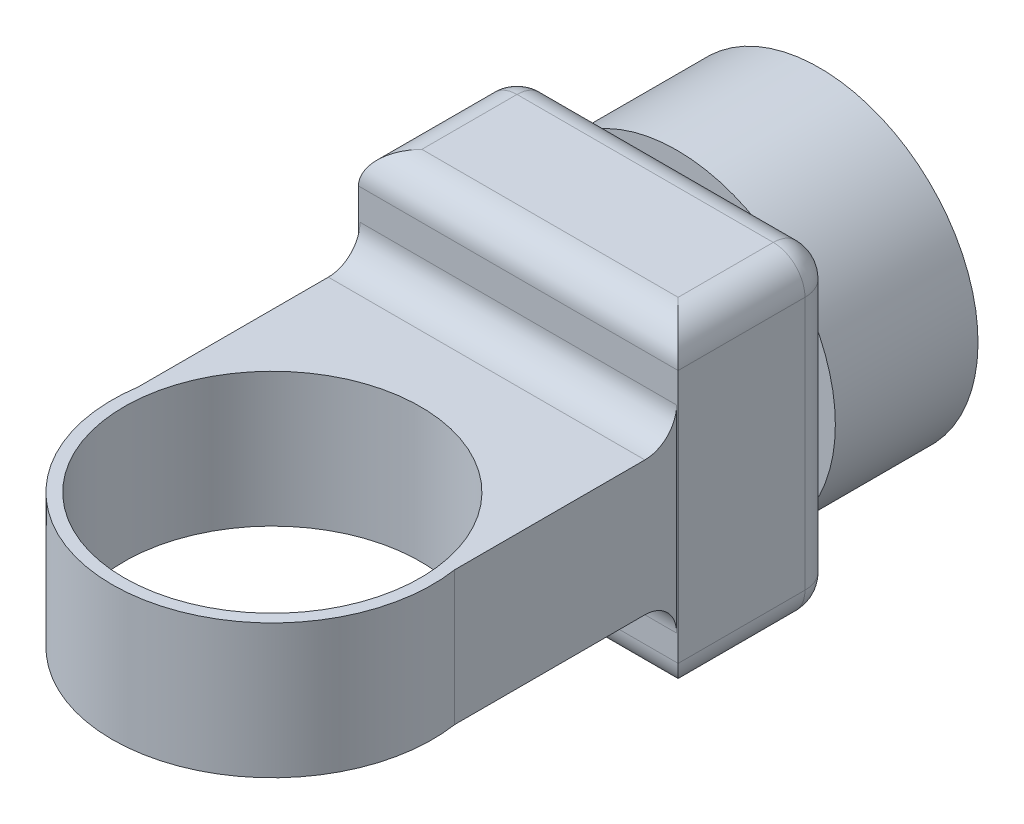
ISO-10303-21;
HEADER;
FILE_DESCRIPTION(('STEP AP214'),'2;1');
FILE_NAME('part.step','',(''),(''),'','','');
FILE_SCHEMA(('AUTOMOTIVE_DESIGN { 1 0 10303 214 1 1 1 1 }'));
ENDSEC;
DATA;
#1=APPLICATION_CONTEXT('core data for automotive mechanical design processes');
#2=APPLICATION_PROTOCOL_DEFINITION('international standard','automotive_design',2000,#1);
#3=PRODUCT_CONTEXT('',#1,'mechanical');
#4=PRODUCT('Part','Part','',(#3));
#5=PRODUCT_RELATED_PRODUCT_CATEGORY('part','',(#4));
#6=PRODUCT_DEFINITION_FORMATION('','',#4);
#7=PRODUCT_DEFINITION_CONTEXT('part definition',#1,'design');
#8=PRODUCT_DEFINITION('design','',#6,#7);
#9=PRODUCT_DEFINITION_SHAPE('','',#8);
#10=(LENGTH_UNIT() NAMED_UNIT(*) SI_UNIT(.MILLI.,.METRE.));
#11=(NAMED_UNIT(*) PLANE_ANGLE_UNIT() SI_UNIT($,.RADIAN.));
#12=(NAMED_UNIT(*) SI_UNIT($,.STERADIAN.) SOLID_ANGLE_UNIT());
#13=UNCERTAINTY_MEASURE_WITH_UNIT(LENGTH_MEASURE(1.E-05),#10,'distance_accuracy_value','');
#14=(GEOMETRIC_REPRESENTATION_CONTEXT(3) GLOBAL_UNCERTAINTY_ASSIGNED_CONTEXT((#13)) GLOBAL_UNIT_ASSIGNED_CONTEXT((#10,
#11,#12)) REPRESENTATION_CONTEXT('',''));
#15=CARTESIAN_POINT('',(0.,0.,0.));
#16=DIRECTION('',(0.,0.,1.));
#17=DIRECTION('',(1.,0.,0.));
#18=AXIS2_PLACEMENT_3D('',#15,#16,#17);
#19=CARTESIAN_POINT('',(0.,0.,-127.584165111629));
#20=DIRECTION('',(0.,0.,-1.));
#21=DIRECTION('',(-1.,0.,0.));
#22=AXIS2_PLACEMENT_3D('',#19,#20,#21);
#23=PLANE('',#22);
#24=DIRECTION('',(0.,1.,0.));
#25=VECTOR('',#24,1.);
#26=CARTESIAN_POINT('',(-40.4149864928319,71.964414077549,-127.584165111629));
#27=LINE('',#26,#25);
#28=CARTESIAN_POINT('',(-40.4149864928319,-18.035585922451,-127.584165111629));
#29=VERTEX_POINT('',#28);
#30=CARTESIAN_POINT('',(-40.4149864928319,-7.47414680412826,-127.584165111629));
#31=VERTEX_POINT('',#30);
#32=EDGE_CURVE('E200',#29,#31,#27,.T.);
#33=ORIENTED_EDGE('',*,*,#32,.T.);
#34=CARTESIAN_POINT('',(0.,21.964414077549,-127.584165111629));
#35=DIRECTION('',(0.,0.,-1.));
#36=DIRECTION('',(-1.,0.,0.));
#37=AXIS2_PLACEMENT_3D('',#34,#35,#36);
#38=CIRCLE('',#37,50.);
#39=CARTESIAN_POINT('',(-30.,-18.035585922451,-127.584165111629));
#40=VERTEX_POINT('',#39);
#41=EDGE_CURVE('E198',#40,#31,#38,.T.);
#42=ORIENTED_EDGE('',*,*,#41,.F.);
#43=DIRECTION('',(-1.,0.,0.));
#44=VECTOR('',#43,1.);
#45=CARTESIAN_POINT('',(-50.4149864928319,-18.035585922451,-127.584165111629));
#46=LINE('',#45,#44);
#47=EDGE_CURVE('E181',#40,#29,#46,.T.);
#48=ORIENTED_EDGE('',*,*,#47,.T.);
#49=EDGE_LOOP('',(#33,#42,#48));
#50=FACE_BOUND('',#49,.T.);
#51=ADVANCED_FACE('F41',(#50),#23,.T.);
#52=CARTESIAN_POINT('',(40.4149864928319,-18.035585922451,-127.584165111629));
#53=VERTEX_POINT('',#52);
#54=CARTESIAN_POINT('',(30.,-18.035585922451,-127.584165111629));
#55=VERTEX_POINT('',#54);
#56=EDGE_CURVE('E196',#53,#55,#46,.T.);
#57=ORIENTED_EDGE('',*,*,#56,.T.);
#58=CARTESIAN_POINT('',(40.4149864928319,-7.47414680412831,-127.584165111629));
#59=VERTEX_POINT('',#58);
#60=EDGE_CURVE('E215',#59,#55,#38,.T.);
#61=ORIENTED_EDGE('',*,*,#60,.F.);
#62=DIRECTION('',(0.,-1.,0.));
#63=VECTOR('',#62,1.);
#64=CARTESIAN_POINT('',(40.4149864928319,-28.035585922451,-127.584165111629));
#65=LINE('',#64,#63);
#66=EDGE_CURVE('E310',#59,#53,#65,.T.);
#67=ORIENTED_EDGE('',*,*,#66,.T.);
#68=EDGE_LOOP('',(#57,#61,#67));
#69=FACE_BOUND('',#68,.T.);
#70=ADVANCED_FACE('F439',(#69),#23,.T.);
#71=CARTESIAN_POINT('',(40.4149864928319,61.964414077549,-127.584165111629));
#72=VERTEX_POINT('',#71);
#73=CARTESIAN_POINT('',(40.4149864928319,51.4029749592263,-127.584165111629));
#74=VERTEX_POINT('',#73);
#75=EDGE_CURVE('E311',#72,#74,#65,.T.);
#76=ORIENTED_EDGE('',*,*,#75,.T.);
#77=CARTESIAN_POINT('',(30.,61.964414077549,-127.584165111629));
#78=VERTEX_POINT('',#77);
#79=EDGE_CURVE('E58',#78,#74,#38,.T.);
#80=ORIENTED_EDGE('',*,*,#79,.F.);
#81=DIRECTION('',(1.,0.,0.));
#82=VECTOR('',#81,1.);
#83=CARTESIAN_POINT('',(50.4149864928319,61.964414077549,-127.584165111629));
#84=LINE('',#83,#82);
#85=EDGE_CURVE('E308',#78,#72,#84,.T.);
#86=ORIENTED_EDGE('',*,*,#85,.T.);
#87=EDGE_LOOP('',(#76,#80,#86));
#88=FACE_BOUND('',#87,.T.);
#89=ADVANCED_FACE('F419',(#88),#23,.T.);
#90=CARTESIAN_POINT('',(0.,42.3,0.));
#91=DIRECTION('',(0.,1.,0.));
#92=DIRECTION('',(0.,0.,1.));
#93=AXIS2_PLACEMENT_3D('',#90,#91,#92);
#94=PLANE('',#93);
#95=DIRECTION('',(0.,0.,-1.));
#96=VECTOR('',#95,1.);
#97=CARTESIAN_POINT('',(49.9272514721125,42.3,-77.5841651116285));
#98=LINE('',#97,#96);
#99=CARTESIAN_POINT('',(49.9272514721125,42.3,-7.58416511162852));
#100=VERTEX_POINT('',#99);
#101=CARTESIAN_POINT('',(49.9272514721125,42.3,-67.5841651116285));
#102=VERTEX_POINT('',#101);
#103=EDGE_CURVE('E237',#100,#102,#98,.T.);
#104=ORIENTED_EDGE('',*,*,#103,.T.);
#105=DIRECTION('',(-1.,0.,0.));
#106=VECTOR('',#105,1.);
#107=CARTESIAN_POINT('',(0.,42.3,-67.5841651116285));
#108=LINE('',#107,#106);
#109=CARTESIAN_POINT('',(-49.9227485278875,42.3,-67.5841651116285));
#110=VERTEX_POINT('',#109);
#111=EDGE_CURVE('E277',#102,#110,#108,.T.);
#112=ORIENTED_EDGE('',*,*,#111,.T.);
#113=DIRECTION('',(0.,0.,1.));
#114=VECTOR('',#113,1.);
#115=CARTESIAN_POINT('',(-49.9227485278875,42.3,-77.5841651116285));
#116=LINE('',#115,#114);
#117=CARTESIAN_POINT('',(-49.9227485278875,42.3,-7.61374936685624));
#118=VERTEX_POINT('',#117);
#119=EDGE_CURVE('E242',#110,#118,#116,.T.);
#120=ORIENTED_EDGE('',*,*,#119,.T.);
#121=CARTESIAN_POINT('',(0.,42.3,0.));
#122=DIRECTION('',(0.,1.,0.));
#123=DIRECTION('',(0.,0.,1.));
#124=AXIS2_PLACEMENT_3D('',#121,#122,#123);
#125=CIRCLE('',#124,50.5);
#126=EDGE_CURVE('E261',#118,#100,#125,.T.);
#127=ORIENTED_EDGE('',*,*,#126,.T.);
#128=EDGE_LOOP('',(#104,#112,#120,#127));
#129=FACE_BOUND('',#128,.T.);
#130=CARTESIAN_POINT('',(0.,42.3,0.));
#131=DIRECTION('',(0.,1.,0.));
#132=DIRECTION('',(0.,0.,1.));
#133=AXIS2_PLACEMENT_3D('',#130,#131,#132);
#134=CIRCLE('',#133,46.75);
#135=CARTESIAN_POINT('',(0.,42.3,46.75));
#136=VERTEX_POINT('',#135);
#137=EDGE_CURVE('E255',#136,#136,#134,.T.);
#138=ORIENTED_EDGE('',*,*,#137,.F.);
#139=EDGE_LOOP('',(#138));
#140=FACE_BOUND('',#139,.T.);
#141=ADVANCED_FACE('F459',(#129,#140),#94,.T.);
#142=CARTESIAN_POINT('',(0.,0.,0.));
#143=DIRECTION('',(0.,1.,0.));
#144=DIRECTION('',(0.,0.,1.));
#145=AXIS2_PLACEMENT_3D('',#142,#143,#144);
#146=PLANE('',#145);
#147=DIRECTION('',(0.,0.,1.));
#148=VECTOR('',#147,1.);
#149=CARTESIAN_POINT('',(-49.9227485278875,0.,-77.5841651116285));
#150=LINE('',#149,#148);
#151=CARTESIAN_POINT('',(-49.9227485278875,0.,-67.5841651116285));
#152=VERTEX_POINT('',#151);
#153=CARTESIAN_POINT('',(-49.9227485278875,0.,-7.61374936685624));
#154=VERTEX_POINT('',#153);
#155=EDGE_CURVE('E241',#152,#154,#150,.T.);
#156=ORIENTED_EDGE('',*,*,#155,.F.);
#157=DIRECTION('',(-1.,0.,0.));
#158=VECTOR('',#157,1.);
#159=CARTESIAN_POINT('',(49.9272514721125,0.,-67.5841651116285));
#160=LINE('',#159,#158);
#161=CARTESIAN_POINT('',(49.9272514721125,0.,-67.5841651116285));
#162=VERTEX_POINT('',#161);
#163=EDGE_CURVE('E275',#152,#162,#160,.F.);
#164=ORIENTED_EDGE('',*,*,#163,.T.);
#165=DIRECTION('',(0.,0.,-1.));
#166=VECTOR('',#165,1.);
#167=CARTESIAN_POINT('',(49.9272514721125,0.,-77.5841651116285));
#168=LINE('',#167,#166);
#169=CARTESIAN_POINT('',(49.9272514721125,0.,-7.58416511162852));
#170=VERTEX_POINT('',#169);
#171=EDGE_CURVE('E238',#170,#162,#168,.T.);
#172=ORIENTED_EDGE('',*,*,#171,.F.);
#173=CARTESIAN_POINT('',(0.,0.,0.));
#174=DIRECTION('',(0.,1.,0.));
#175=DIRECTION('',(0.,0.,1.));
#176=AXIS2_PLACEMENT_3D('',#173,#174,#175);
#177=CIRCLE('',#176,50.5);
#178=EDGE_CURVE('E258',#154,#170,#177,.T.);
#179=ORIENTED_EDGE('',*,*,#178,.F.);
#180=EDGE_LOOP('',(#156,#164,#172,#179));
#181=FACE_BOUND('',#180,.T.);
#182=CARTESIAN_POINT('',(0.,0.,0.));
#183=DIRECTION('',(0.,1.,0.));
#184=DIRECTION('',(0.,0.,1.));
#185=AXIS2_PLACEMENT_3D('',#182,#183,#184);
#186=CIRCLE('',#185,46.75);
#187=CARTESIAN_POINT('',(0.,0.,46.75));
#188=VERTEX_POINT('',#187);
#189=EDGE_CURVE('E250',#188,#188,#186,.T.);
#190=ORIENTED_EDGE('',*,*,#189,.T.);
#191=EDGE_LOOP('',(#190));
#192=FACE_BOUND('',#191,.T.);
#193=ADVANCED_FACE('F463',(#181,#192),#146,.F.);
#194=CARTESIAN_POINT('',(0.,42.3,0.));
#195=DIRECTION('',(0.,-1.,0.));
#196=DIRECTION('',(0.,0.,-1.));
#197=AXIS2_PLACEMENT_3D('',#194,#195,#196);
#198=CYLINDRICAL_SURFACE('',#197,50.5);
#199=ORIENTED_EDGE('',*,*,#126,.F.);
#200=DIRECTION('',(0.,-1.,0.));
#201=VECTOR('',#200,1.);
#202=CARTESIAN_POINT('',(-49.9227485278875,42.3,-7.61374936685624));
#203=LINE('',#202,#201);
#204=EDGE_CURVE('E264',#118,#154,#203,.T.);
#205=ORIENTED_EDGE('',*,*,#204,.T.);
#206=ORIENTED_EDGE('',*,*,#178,.T.);
#207=DIRECTION('',(0.,1.,0.));
#208=VECTOR('',#207,1.);
#209=CARTESIAN_POINT('',(49.9272514721125,0.,-7.58416511162852));
#210=LINE('',#209,#208);
#211=EDGE_CURVE('E244',#170,#100,#210,.T.);
#212=ORIENTED_EDGE('',*,*,#211,.T.);
#213=EDGE_LOOP('',(#199,#205,#206,#212));
#214=FACE_BOUND('',#213,.T.);
#215=ADVANCED_FACE('F469',(#214),#198,.T.);
#216=CARTESIAN_POINT('',(0.,42.3,0.));
#217=DIRECTION('',(0.,-1.,0.));
#218=DIRECTION('',(0.,0.,-1.));
#219=AXIS2_PLACEMENT_3D('',#216,#217,#218);
#220=CYLINDRICAL_SURFACE('',#219,46.75);
#221=ORIENTED_EDGE('',*,*,#137,.T.);
#222=EDGE_LOOP('',(#221));
#223=FACE_BOUND('',#222,.T.);
#224=ORIENTED_EDGE('',*,*,#189,.F.);
#225=EDGE_LOOP('',(#224));
#226=FACE_BOUND('',#225,.T.);
#227=ADVANCED_FACE('F474',(#223,#226),#220,.F.);
#228=CARTESIAN_POINT('',(-49.9227485278875,0.,-77.5841651116285));
#229=DIRECTION('',(-1.,0.,0.));
#230=DIRECTION('',(0.,0.,1.));
#231=AXIS2_PLACEMENT_3D('',#228,#229,#230);
#232=PLANE('',#231);
#233=ORIENTED_EDGE('',*,*,#204,.F.);
#234=ORIENTED_EDGE('',*,*,#119,.F.);
#235=CARTESIAN_POINT('',(-49.9227485278875,52.3,-67.5841651116285));
#236=DIRECTION('',(-1.,0.,0.));
#237=DIRECTION('',(0.,0.,1.));
#238=AXIS2_PLACEMENT_3D('',#235,#236,#237);
#239=CIRCLE('',#238,10.);
#240=CARTESIAN_POINT('',(-49.9227485278875,52.3,-77.5841651116285));
#241=VERTEX_POINT('',#240);
#242=EDGE_CURVE('E285',#110,#241,#239,.F.);
#243=ORIENTED_EDGE('',*,*,#242,.T.);
#244=DIRECTION('',(0.,1.,0.));
#245=VECTOR('',#244,1.);
#246=CARTESIAN_POINT('',(-49.9227485278875,0.,-77.5841651116285));
#247=LINE('',#246,#245);
#248=CARTESIAN_POINT('',(-49.9227485278875,-10.,-77.5841651116285));
#249=VERTEX_POINT('',#248);
#250=EDGE_CURVE('E248',#249,#241,#247,.T.);
#251=ORIENTED_EDGE('',*,*,#250,.F.);
#252=CARTESIAN_POINT('',(-49.9227485278875,-10.,-67.5841651116285));
#253=DIRECTION('',(-1.,0.,0.));
#254=DIRECTION('',(0.,0.,1.));
#255=AXIS2_PLACEMENT_3D('',#252,#253,#254);
#256=CIRCLE('',#255,10.);
#257=EDGE_CURVE('E280',#249,#152,#256,.F.);
#258=ORIENTED_EDGE('',*,*,#257,.T.);
#259=ORIENTED_EDGE('',*,*,#155,.T.);
#260=EDGE_LOOP('',(#233,#234,#243,#251,#258,#259));
#261=FACE_BOUND('',#260,.T.);
#262=ADVANCED_FACE('F582',(#261),#232,.T.);
#263=CARTESIAN_POINT('',(49.9272514721125,0.,-77.5841651116285));
#264=DIRECTION('',(1.,0.,0.));
#265=DIRECTION('',(0.,0.,-1.));
#266=AXIS2_PLACEMENT_3D('',#263,#264,#265);
#267=PLANE('',#266);
#268=ORIENTED_EDGE('',*,*,#103,.F.);
#269=ORIENTED_EDGE('',*,*,#211,.F.);
#270=ORIENTED_EDGE('',*,*,#171,.T.);
#271=CARTESIAN_POINT('',(49.9272514721125,-10.,-67.5841651116285));
#272=DIRECTION('',(1.,0.,0.));
#273=DIRECTION('',(0.,0.,-1.));
#274=AXIS2_PLACEMENT_3D('',#271,#272,#273);
#275=CIRCLE('',#274,10.);
#276=CARTESIAN_POINT('',(49.9272514721125,-10.,-77.5841651116285));
#277=VERTEX_POINT('',#276);
#278=EDGE_CURVE('E282',#162,#277,#275,.F.);
#279=ORIENTED_EDGE('',*,*,#278,.T.);
#280=DIRECTION('',(0.,1.,0.));
#281=VECTOR('',#280,1.);
#282=CARTESIAN_POINT('',(49.9272514721125,0.,-77.5841651116285));
#283=LINE('',#282,#281);
#284=CARTESIAN_POINT('',(49.9272514721125,52.3,-77.5841651116285));
#285=VERTEX_POINT('',#284);
#286=EDGE_CURVE('E251',#277,#285,#283,.T.);
#287=ORIENTED_EDGE('',*,*,#286,.T.);
#288=CARTESIAN_POINT('',(49.9272514721125,52.3,-67.5841651116285));
#289=DIRECTION('',(1.,0.,0.));
#290=DIRECTION('',(0.,0.,-1.));
#291=AXIS2_PLACEMENT_3D('',#288,#289,#290);
#292=CIRCLE('',#291,10.);
#293=EDGE_CURVE('E288',#285,#102,#292,.F.);
#294=ORIENTED_EDGE('',*,*,#293,.T.);
#295=EDGE_LOOP('',(#268,#269,#270,#279,#287,#294));
#296=FACE_BOUND('',#295,.T.);
#297=ADVANCED_FACE('F572',(#296),#267,.T.);
#298=CARTESIAN_POINT('',(-50.4149864928319,71.964414077549,-127.584165111629));
#299=DIRECTION('',(1.,0.,0.));
#300=DIRECTION('',(0.,0.,-1.));
#301=AXIS2_PLACEMENT_3D('',#298,#299,#300);
#302=PLANE('',#301);
#303=DIRECTION('',(0.,1.,0.));
#304=VECTOR('',#303,1.);
#305=CARTESIAN_POINT('',(-50.4149864928319,-28.035585922451,-117.584165111629));
#306=LINE('',#305,#304);
#307=CARTESIAN_POINT('',(-50.4149864928319,61.964414077549,-117.584165111629));
#308=VERTEX_POINT('',#307);
#309=CARTESIAN_POINT('',(-50.4149864928319,-18.035585922451,-117.584165111629));
#310=VERTEX_POINT('',#309);
#311=EDGE_CURVE('E313',#308,#310,#306,.F.);
#312=ORIENTED_EDGE('',*,*,#311,.T.);
#313=DIRECTION('',(0.,0.,1.));
#314=VECTOR('',#313,1.);
#315=CARTESIAN_POINT('',(-50.4149864928319,-18.035585922451,-127.584165111629));
#316=LINE('',#315,#314);
#317=CARTESIAN_POINT('',(-50.4149864928319,-18.035585922451,-77.5841651116285));
#318=VERTEX_POINT('',#317);
#319=EDGE_CURVE('E317',#310,#318,#316,.T.);
#320=ORIENTED_EDGE('',*,*,#319,.T.);
#321=DIRECTION('',(0.,1.,0.));
#322=VECTOR('',#321,1.);
#323=CARTESIAN_POINT('',(-50.4149864928319,71.964414077549,-77.5841651116285));
#324=LINE('',#323,#322);
#325=CARTESIAN_POINT('',(-50.4149864928319,61.964414077549,-77.5841651116285));
#326=VERTEX_POINT('',#325);
#327=EDGE_CURVE('E231',#318,#326,#324,.T.);
#328=ORIENTED_EDGE('',*,*,#327,.T.);
#329=DIRECTION('',(0.,0.,1.));
#330=VECTOR('',#329,1.);
#331=CARTESIAN_POINT('',(-50.4149864928319,61.964414077549,-127.584165111629));
#332=LINE('',#331,#330);
#333=EDGE_CURVE('E315',#326,#308,#332,.F.);
#334=ORIENTED_EDGE('',*,*,#333,.T.);
#335=EDGE_LOOP('',(#312,#320,#328,#334));
#336=FACE_BOUND('',#335,.T.);
#337=ADVANCED_FACE('F380',(#336),#302,.F.);
#338=CARTESIAN_POINT('',(50.4149864928319,71.964414077549,-127.584165111629));
#339=DIRECTION('',(0.,-1.,0.));
#340=DIRECTION('',(0.,0.,-1.));
#341=AXIS2_PLACEMENT_3D('',#338,#339,#340);
#342=PLANE('',#341);
#343=DIRECTION('',(0.,0.,1.));
#344=VECTOR('',#343,1.);
#345=CARTESIAN_POINT('',(-40.4149864928319,71.964414077549,-127.584165111629));
#346=LINE('',#345,#344);
#347=CARTESIAN_POINT('',(-40.4149864928319,71.964414077549,-117.584165111629));
#348=VERTEX_POINT('',#347);
#349=CARTESIAN_POINT('',(-40.4149864928319,71.964414077549,-87.5841651116285));
#350=VERTEX_POINT('',#349);
#351=EDGE_CURVE('E323',#348,#350,#346,.T.);
#352=ORIENTED_EDGE('',*,*,#351,.T.);
#353=DIRECTION('',(1.,0.,0.));
#354=VECTOR('',#353,1.);
#355=CARTESIAN_POINT('',(50.4149864928319,71.964414077549,-87.5841651116285));
#356=LINE('',#355,#354);
#357=CARTESIAN_POINT('',(40.4149864928319,71.964414077549,-87.5841651116285));
#358=VERTEX_POINT('',#357);
#359=EDGE_CURVE('E11',#350,#358,#356,.T.);
#360=ORIENTED_EDGE('',*,*,#359,.T.);
#361=DIRECTION('',(0.,0.,1.));
#362=VECTOR('',#361,1.);
#363=CARTESIAN_POINT('',(40.4149864928319,71.964414077549,-127.584165111629));
#364=LINE('',#363,#362);
#365=CARTESIAN_POINT('',(40.4149864928319,71.964414077549,-117.584165111629));
#366=VERTEX_POINT('',#365);
#367=EDGE_CURVE('E50',#358,#366,#364,.F.);
#368=ORIENTED_EDGE('',*,*,#367,.T.);
#369=DIRECTION('',(1.,0.,0.));
#370=VECTOR('',#369,1.);
#371=CARTESIAN_POINT('',(-50.4149864928319,71.964414077549,-117.584165111629));
#372=LINE('',#371,#370);
#373=EDGE_CURVE('E325',#366,#348,#372,.F.);
#374=ORIENTED_EDGE('',*,*,#373,.T.);
#375=EDGE_LOOP('',(#352,#360,#368,#374));
#376=FACE_BOUND('',#375,.T.);
#377=ADVANCED_FACE('F554',(#376),#342,.F.);
#378=CARTESIAN_POINT('',(50.4149864928319,71.964414077549,-127.584165111629));
#379=DIRECTION('',(-1.,0.,0.));
#380=DIRECTION('',(0.,-1.,0.));
#381=AXIS2_PLACEMENT_3D('',#378,#379,#380);
#382=PLANE('',#381);
#383=DIRECTION('',(0.,-1.,0.));
#384=VECTOR('',#383,1.);
#385=CARTESIAN_POINT('',(50.4149864928319,71.964414077549,-77.5841651116285));
#386=LINE('',#385,#384);
#387=CARTESIAN_POINT('',(50.4149864928319,61.964414077549,-77.5841651116285));
#388=VERTEX_POINT('',#387);
#389=CARTESIAN_POINT('',(50.4149864928319,-18.035585922451,-77.5841651116285));
#390=VERTEX_POINT('',#389);
#391=EDGE_CURVE('E234',#388,#390,#386,.T.);
#392=ORIENTED_EDGE('',*,*,#391,.T.);
#393=DIRECTION('',(0.,0.,1.));
#394=VECTOR('',#393,1.);
#395=CARTESIAN_POINT('',(50.4149864928319,-18.035585922451,-127.584165111629));
#396=LINE('',#395,#394);
#397=CARTESIAN_POINT('',(50.4149864928319,-18.035585922451,-117.584165111629));
#398=VERTEX_POINT('',#397);
#399=EDGE_CURVE('E303',#390,#398,#396,.F.);
#400=ORIENTED_EDGE('',*,*,#399,.T.);
#401=DIRECTION('',(0.,-1.,0.));
#402=VECTOR('',#401,1.);
#403=CARTESIAN_POINT('',(50.4149864928319,71.964414077549,-117.584165111629));
#404=LINE('',#403,#402);
#405=CARTESIAN_POINT('',(50.4149864928319,61.964414077549,-117.584165111629));
#406=VERTEX_POINT('',#405);
#407=EDGE_CURVE('E299',#398,#406,#404,.F.);
#408=ORIENTED_EDGE('',*,*,#407,.T.);
#409=DIRECTION('',(0.,0.,1.));
#410=VECTOR('',#409,1.);
#411=CARTESIAN_POINT('',(50.4149864928319,61.964414077549,-127.584165111629));
#412=LINE('',#411,#410);
#413=EDGE_CURVE('E301',#406,#388,#412,.T.);
#414=ORIENTED_EDGE('',*,*,#413,.T.);
#415=EDGE_LOOP('',(#392,#400,#408,#414));
#416=FACE_BOUND('',#415,.T.);
#417=ADVANCED_FACE('F403',(#416),#382,.F.);
#418=CARTESIAN_POINT('',(50.4149864928319,-28.035585922451,-127.584165111629));
#419=DIRECTION('',(0.,1.,0.));
#420=DIRECTION('',(0.,0.,1.));
#421=AXIS2_PLACEMENT_3D('',#418,#419,#420);
#422=PLANE('',#421);
#423=DIRECTION('',(-1.,0.,0.));
#424=VECTOR('',#423,1.);
#425=CARTESIAN_POINT('',(50.4149864928319,-28.035585922451,-117.584165111629));
#426=LINE('',#425,#424);
#427=CARTESIAN_POINT('',(-40.4149864928319,-28.035585922451,-117.584165111629));
#428=VERTEX_POINT('',#427);
#429=CARTESIAN_POINT('',(40.4149864928319,-28.035585922451,-117.584165111629));
#430=VERTEX_POINT('',#429);
#431=EDGE_CURVE('E294',#428,#430,#426,.F.);
#432=ORIENTED_EDGE('',*,*,#431,.T.);
#433=DIRECTION('',(0.,0.,1.));
#434=VECTOR('',#433,1.);
#435=CARTESIAN_POINT('',(40.4149864928319,-28.035585922451,-127.584165111629));
#436=LINE('',#435,#434);
#437=CARTESIAN_POINT('',(40.4149864928319,-28.035585922451,-87.5841651116285));
#438=VERTEX_POINT('',#437);
#439=EDGE_CURVE('E296',#430,#438,#436,.T.);
#440=ORIENTED_EDGE('',*,*,#439,.T.);
#441=DIRECTION('',(-1.,0.,0.));
#442=VECTOR('',#441,1.);
#443=CARTESIAN_POINT('',(50.4149864928319,-28.035585922451,-87.5841651116285));
#444=LINE('',#443,#442);
#445=CARTESIAN_POINT('',(-40.4149864928319,-28.035585922451,-87.5841651116285));
#446=VERTEX_POINT('',#445);
#447=EDGE_CURVE('E290',#438,#446,#444,.T.);
#448=ORIENTED_EDGE('',*,*,#447,.T.);
#449=DIRECTION('',(0.,0.,1.));
#450=VECTOR('',#449,1.);
#451=CARTESIAN_POINT('',(-40.4149864928318,-28.035585922451,-127.584165111629));
#452=LINE('',#451,#450);
#453=EDGE_CURVE('E292',#446,#428,#452,.F.);
#454=ORIENTED_EDGE('',*,*,#453,.T.);
#455=EDGE_LOOP('',(#432,#440,#448,#454));
#456=FACE_BOUND('',#455,.T.);
#457=ADVANCED_FACE('F448',(#456),#422,.F.);
#458=CARTESIAN_POINT('',(-40.4149864928319,61.964414077549,-127.584165111629));
#459=VERTEX_POINT('',#458);
#460=CARTESIAN_POINT('',(-30.,61.964414077549,-127.584165111629));
#461=VERTEX_POINT('',#460);
#462=EDGE_CURVE('E194',#459,#461,#84,.T.);
#463=ORIENTED_EDGE('',*,*,#462,.T.);
#464=CARTESIAN_POINT('',(-40.4149864928319,51.4029749592262,-127.584165111629));
#465=VERTEX_POINT('',#464);
#466=EDGE_CURVE('E217',#465,#461,#38,.T.);
#467=ORIENTED_EDGE('',*,*,#466,.F.);
#468=EDGE_CURVE('E306',#465,#459,#27,.T.);
#469=ORIENTED_EDGE('',*,*,#468,.T.);
#470=EDGE_LOOP('',(#463,#467,#469));
#471=FACE_BOUND('',#470,.T.);
#472=ADVANCED_FACE('F441',(#471),#23,.T.);
#473=CARTESIAN_POINT('',(0.,0.,-77.5841651116285));
#474=DIRECTION('',(0.,0.,-1.));
#475=DIRECTION('',(-1.,0.,0.));
#476=AXIS2_PLACEMENT_3D('',#473,#474,#475);
#477=PLANE('',#476);
#478=DIRECTION('',(-1.,0.,0.));
#479=VECTOR('',#478,1.);
#480=CARTESIAN_POINT('',(-49.9227485278875,-10.,-77.5841651116285));
#481=LINE('',#480,#479);
#482=EDGE_CURVE('E272',#277,#249,#481,.T.);
#483=ORIENTED_EDGE('',*,*,#482,.T.);
#484=ORIENTED_EDGE('',*,*,#250,.T.);
#485=DIRECTION('',(-1.,0.,0.));
#486=VECTOR('',#485,1.);
#487=CARTESIAN_POINT('',(0.,52.3,-77.5841651116285));
#488=LINE('',#487,#486);
#489=EDGE_CURVE('E269',#241,#285,#488,.F.);
#490=ORIENTED_EDGE('',*,*,#489,.T.);
#491=ORIENTED_EDGE('',*,*,#286,.F.);
#492=EDGE_LOOP('',(#483,#484,#490,#491));
#493=FACE_BOUND('',#492,.T.);
#494=ORIENTED_EDGE('',*,*,#327,.F.);
#495=DIRECTION('',(-1.,0.,0.));
#496=VECTOR('',#495,1.);
#497=CARTESIAN_POINT('',(0.,-18.035585922451,-77.5841651116285));
#498=LINE('',#497,#496);
#499=EDGE_CURVE('E321',#318,#390,#498,.F.);
#500=ORIENTED_EDGE('',*,*,#499,.T.);
#501=ORIENTED_EDGE('',*,*,#391,.F.);
#502=DIRECTION('',(1.,0.,0.));
#503=VECTOR('',#502,1.);
#504=CARTESIAN_POINT('',(0.,61.964414077549,-77.5841651116285));
#505=LINE('',#504,#503);
#506=EDGE_CURVE('E319',#388,#326,#505,.F.);
#507=ORIENTED_EDGE('',*,*,#506,.T.);
#508=EDGE_LOOP('',(#494,#500,#501,#507));
#509=FACE_BOUND('',#508,.T.);
#510=ADVANCED_FACE('F387',(#493,#509),#477,.F.);
#511=CARTESIAN_POINT('',(0.,-10.,-67.5841651116285));
#512=DIRECTION('',(1.,0.,0.));
#513=DIRECTION('',(0.,0.,-1.));
#514=AXIS2_PLACEMENT_3D('',#511,#512,#513);
#515=CYLINDRICAL_SURFACE('',#514,10.);
#516=ORIENTED_EDGE('',*,*,#278,.F.);
#517=ORIENTED_EDGE('',*,*,#163,.F.);
#518=ORIENTED_EDGE('',*,*,#257,.F.);
#519=ORIENTED_EDGE('',*,*,#482,.F.);
#520=EDGE_LOOP('',(#516,#517,#518,#519));
#521=FACE_BOUND('',#520,.T.);
#522=ADVANCED_FACE('F454',(#521),#515,.F.);
#523=CARTESIAN_POINT('',(0.,52.3,-67.5841651116285));
#524=DIRECTION('',(-1.,0.,0.));
#525=DIRECTION('',(0.,0.,1.));
#526=AXIS2_PLACEMENT_3D('',#523,#524,#525);
#527=CYLINDRICAL_SURFACE('',#526,10.);
#528=ORIENTED_EDGE('',*,*,#293,.F.);
#529=ORIENTED_EDGE('',*,*,#489,.F.);
#530=ORIENTED_EDGE('',*,*,#242,.F.);
#531=ORIENTED_EDGE('',*,*,#111,.F.);
#532=EDGE_LOOP('',(#528,#529,#530,#531));
#533=FACE_BOUND('',#532,.T.);
#534=ADVANCED_FACE('F482',(#533),#527,.F.);
#535=CARTESIAN_POINT('',(-40.4149864928319,61.964414077549,-127.584165111629));
#536=DIRECTION('',(0.,0.,1.));
#537=DIRECTION('',(1.,0.,0.));
#538=AXIS2_PLACEMENT_3D('',#535,#536,#537);
#539=CYLINDRICAL_SURFACE('',#538,10.);
#540=CARTESIAN_POINT('',(-40.4149864928319,61.964414077549,-117.584165111629));
#541=DIRECTION('',(0.,0.,-1.));
#542=DIRECTION('',(-1.,0.,0.));
#543=AXIS2_PLACEMENT_3D('',#540,#541,#542);
#544=CIRCLE('',#543,10.);
#545=EDGE_CURVE('E363',#308,#348,#544,.T.);
#546=ORIENTED_EDGE('',*,*,#545,.F.);
#547=ORIENTED_EDGE('',*,*,#333,.F.);
#548=CARTESIAN_POINT('',(-40.4149864928319,61.964414077549,-87.5841651116285));
#549=DIRECTION('',(0.707106781186547,0.,0.707106781186547));
#550=DIRECTION('',(-0.707106781186547,0.,0.707106781186547));
#551=AXIS2_PLACEMENT_3D('',#548,#549,#550);
#552=ELLIPSE('',#551,14.1421356237309,10.);
#553=EDGE_CURVE('E45',#350,#326,#552,.T.);
#554=ORIENTED_EDGE('',*,*,#553,.F.);
#555=ORIENTED_EDGE('',*,*,#351,.F.);
#556=EDGE_LOOP('',(#546,#547,#554,#555));
#557=FACE_BOUND('',#556,.T.);
#558=ADVANCED_FACE('F43',(#557),#539,.T.);
#559=CARTESIAN_POINT('',(50.4149864928319,61.964414077549,-87.5841651116285));
#560=DIRECTION('',(1.,0.,0.));
#561=DIRECTION('',(0.,0.,-1.));
#562=AXIS2_PLACEMENT_3D('',#559,#560,#561);
#563=CYLINDRICAL_SURFACE('',#562,10.);
#564=ORIENTED_EDGE('',*,*,#553,.T.);
#565=ORIENTED_EDGE('',*,*,#506,.F.);
#566=CARTESIAN_POINT('',(40.4149864928319,61.964414077549,-87.5841651116285));
#567=DIRECTION('',(-0.707106781186547,0.,0.707106781186547));
#568=DIRECTION('',(0.707106781186547,0.,0.707106781186547));
#569=AXIS2_PLACEMENT_3D('',#566,#567,#568);
#570=ELLIPSE('',#569,14.1421356237309,10.);
#571=EDGE_CURVE('E361',#358,#388,#570,.F.);
#572=ORIENTED_EDGE('',*,*,#571,.F.);
#573=ORIENTED_EDGE('',*,*,#359,.F.);
#574=EDGE_LOOP('',(#564,#565,#572,#573));
#575=FACE_BOUND('',#574,.T.);
#576=ADVANCED_FACE('F374',(#575),#563,.T.);
#577=CARTESIAN_POINT('',(-40.4149864928319,61.964414077549,-117.584165111629));
#578=DIRECTION('',(0.,1.,0.));
#579=DIRECTION('',(0.,0.,1.));
#580=AXIS2_PLACEMENT_3D('',#577,#578,#579);
#581=SPHERICAL_SURFACE('',#580,10.);
#582=CARTESIAN_POINT('',(-40.4149864928319,61.964414077549,-117.584165111629));
#583=DIRECTION('',(0.,1.,0.));
#584=DIRECTION('',(0.,0.,1.));
#585=AXIS2_PLACEMENT_3D('',#582,#583,#584);
#586=CIRCLE('',#585,10.);
#587=EDGE_CURVE('E355',#308,#459,#586,.F.);
#588=ORIENTED_EDGE('',*,*,#587,.F.);
#589=ORIENTED_EDGE('',*,*,#545,.T.);
#590=CARTESIAN_POINT('',(-40.4149864928319,61.964414077549,-117.584165111629));
#591=DIRECTION('',(-1.,0.,0.));
#592=DIRECTION('',(0.,0.,1.));
#593=AXIS2_PLACEMENT_3D('',#590,#591,#592);
#594=CIRCLE('',#593,10.);
#595=EDGE_CURVE('E358',#459,#348,#594,.F.);
#596=ORIENTED_EDGE('',*,*,#595,.F.);
#597=EDGE_LOOP('',(#588,#589,#596));
#598=FACE_BOUND('',#597,.T.);
#599=ADVANCED_FACE('F514',(#598),#581,.T.);
#600=CARTESIAN_POINT('',(40.4149864928319,61.964414077549,-127.584165111629));
#601=DIRECTION('',(0.,0.,1.));
#602=DIRECTION('',(1.,0.,0.));
#603=AXIS2_PLACEMENT_3D('',#600,#601,#602);
#604=CYLINDRICAL_SURFACE('',#603,10.);
#605=ORIENTED_EDGE('',*,*,#571,.T.);
#606=ORIENTED_EDGE('',*,*,#413,.F.);
#607=CARTESIAN_POINT('',(40.4149864928319,61.964414077549,-117.584165111629));
#608=DIRECTION('',(0.,0.,-1.));
#609=DIRECTION('',(-1.,0.,0.));
#610=AXIS2_PLACEMENT_3D('',#607,#608,#609);
#611=CIRCLE('',#610,10.);
#612=EDGE_CURVE('E352',#366,#406,#611,.T.);
#613=ORIENTED_EDGE('',*,*,#612,.F.);
#614=ORIENTED_EDGE('',*,*,#367,.F.);
#615=EDGE_LOOP('',(#605,#606,#613,#614));
#616=FACE_BOUND('',#615,.T.);
#617=ADVANCED_FACE('F408',(#616),#604,.T.);
#618=CARTESIAN_POINT('',(0.,61.964414077549,-117.584165111629));
#619=DIRECTION('',(-1.,0.,0.));
#620=DIRECTION('',(0.,0.,1.));
#621=AXIS2_PLACEMENT_3D('',#618,#619,#620);
#622=CYLINDRICAL_SURFACE('',#621,10.);
#623=ORIENTED_EDGE('',*,*,#595,.T.);
#624=ORIENTED_EDGE('',*,*,#373,.F.);
#625=CARTESIAN_POINT('',(40.4149864928319,61.964414077549,-117.584165111629));
#626=DIRECTION('',(1.,0.,0.));
#627=DIRECTION('',(0.,0.,-1.));
#628=AXIS2_PLACEMENT_3D('',#625,#626,#627);
#629=CIRCLE('',#628,10.);
#630=EDGE_CURVE('E349',#72,#366,#629,.T.);
#631=ORIENTED_EDGE('',*,*,#630,.F.);
#632=ORIENTED_EDGE('',*,*,#85,.F.);
#633=DIRECTION('',(-1.,0.,0.));
#634=VECTOR('',#633,1.);
#635=CARTESIAN_POINT('',(0.,61.964414077549,-127.584165111629));
#636=LINE('',#635,#634);
#637=EDGE_CURVE('E65',#461,#78,#636,.F.);
#638=ORIENTED_EDGE('',*,*,#637,.F.);
#639=ORIENTED_EDGE('',*,*,#462,.F.);
#640=EDGE_LOOP('',(#623,#624,#631,#632,#638,#639));
#641=FACE_BOUND('',#640,.T.);
#642=ADVANCED_FACE('F508',(#641),#622,.T.);
#643=CARTESIAN_POINT('',(-40.4149864928319,0.,-117.584165111629));
#644=DIRECTION('',(0.,-1.,0.));
#645=DIRECTION('',(0.,0.,-1.));
#646=AXIS2_PLACEMENT_3D('',#643,#644,#645);
#647=CYLINDRICAL_SURFACE('',#646,10.);
#648=ORIENTED_EDGE('',*,*,#587,.T.);
#649=ORIENTED_EDGE('',*,*,#468,.F.);
#650=DIRECTION('',(0.,-1.,0.));
#651=VECTOR('',#650,1.);
#652=CARTESIAN_POINT('',(-40.4149864928319,0.,-127.584165111629));
#653=LINE('',#652,#651);
#654=EDGE_CURVE('E226',#31,#465,#653,.F.);
#655=ORIENTED_EDGE('',*,*,#654,.F.);
#656=ORIENTED_EDGE('',*,*,#32,.F.);
#657=CARTESIAN_POINT('',(-40.4149864928319,-18.035585922451,-117.584165111629));
#658=DIRECTION('',(0.,-1.,0.));
#659=DIRECTION('',(0.,0.,-1.));
#660=AXIS2_PLACEMENT_3D('',#657,#658,#659);
#661=CIRCLE('',#660,10.);
#662=EDGE_CURVE('E347',#310,#29,#661,.T.);
#663=ORIENTED_EDGE('',*,*,#662,.F.);
#664=ORIENTED_EDGE('',*,*,#311,.F.);
#665=EDGE_LOOP('',(#648,#649,#655,#656,#663,#664));
#666=FACE_BOUND('',#665,.T.);
#667=ADVANCED_FACE('F505',(#666),#647,.T.);
#668=CARTESIAN_POINT('',(40.4149864928319,61.964414077549,-117.584165111629));
#669=DIRECTION('',(0.,1.,0.));
#670=DIRECTION('',(0.,0.,1.));
#671=AXIS2_PLACEMENT_3D('',#668,#669,#670);
#672=SPHERICAL_SURFACE('',#671,10.);
#673=ORIENTED_EDGE('',*,*,#630,.T.);
#674=ORIENTED_EDGE('',*,*,#612,.T.);
#675=CARTESIAN_POINT('',(40.4149864928319,61.964414077549,-117.584165111629));
#676=DIRECTION('',(0.,1.,0.));
#677=DIRECTION('',(0.,0.,1.));
#678=AXIS2_PLACEMENT_3D('',#675,#676,#677);
#679=CIRCLE('',#678,10.);
#680=EDGE_CURVE('E344',#72,#406,#679,.F.);
#681=ORIENTED_EDGE('',*,*,#680,.F.);
#682=EDGE_LOOP('',(#673,#674,#681));
#683=FACE_BOUND('',#682,.T.);
#684=ADVANCED_FACE('F411',(#683),#672,.T.);
#685=CARTESIAN_POINT('',(-40.4149864928319,-18.035585922451,-117.584165111629));
#686=DIRECTION('',(0.,0.,-1.));
#687=DIRECTION('',(-1.,0.,0.));
#688=AXIS2_PLACEMENT_3D('',#685,#686,#687);
#689=SPHERICAL_SURFACE('',#688,10.);
#690=CARTESIAN_POINT('',(-40.4149864928319,-18.035585922451,-117.584165111629));
#691=DIRECTION('',(0.,0.,-1.));
#692=DIRECTION('',(-1.,0.,0.));
#693=AXIS2_PLACEMENT_3D('',#690,#691,#692);
#694=CIRCLE('',#693,10.);
#695=EDGE_CURVE('E340',#310,#428,#694,.F.);
#696=ORIENTED_EDGE('',*,*,#695,.F.);
#697=ORIENTED_EDGE('',*,*,#662,.T.);
#698=CARTESIAN_POINT('',(-40.4149864928319,-18.035585922451,-117.584165111629));
#699=DIRECTION('',(-1.,0.,0.));
#700=DIRECTION('',(0.,0.,1.));
#701=AXIS2_PLACEMENT_3D('',#698,#699,#700);
#702=CIRCLE('',#701,10.);
#703=EDGE_CURVE('E190',#428,#29,#702,.F.);
#704=ORIENTED_EDGE('',*,*,#703,.F.);
#705=EDGE_LOOP('',(#696,#697,#704));
#706=FACE_BOUND('',#705,.T.);
#707=ADVANCED_FACE('F499',(#706),#689,.T.);
#708=CARTESIAN_POINT('',(40.4149864928319,0.,-117.584165111629));
#709=DIRECTION('',(0.,1.,0.));
#710=DIRECTION('',(-1.,0.,0.));
#711=AXIS2_PLACEMENT_3D('',#708,#709,#710);
#712=CYLINDRICAL_SURFACE('',#711,10.);
#713=ORIENTED_EDGE('',*,*,#680,.T.);
#714=ORIENTED_EDGE('',*,*,#407,.F.);
#715=CARTESIAN_POINT('',(40.4149864928319,-18.035585922451,-117.584165111629));
#716=DIRECTION('',(0.,-1.,0.));
#717=DIRECTION('',(0.,0.,-1.));
#718=AXIS2_PLACEMENT_3D('',#715,#716,#717);
#719=CIRCLE('',#718,10.);
#720=EDGE_CURVE('E337',#53,#398,#719,.T.);
#721=ORIENTED_EDGE('',*,*,#720,.F.);
#722=ORIENTED_EDGE('',*,*,#66,.F.);
#723=DIRECTION('',(0.,1.,0.));
#724=VECTOR('',#723,1.);
#725=CARTESIAN_POINT('',(40.4149864928319,0.,-127.584165111629));
#726=LINE('',#725,#724);
#727=EDGE_CURVE('E223',#74,#59,#726,.F.);
#728=ORIENTED_EDGE('',*,*,#727,.F.);
#729=ORIENTED_EDGE('',*,*,#75,.F.);
#730=EDGE_LOOP('',(#713,#714,#721,#722,#728,#729));
#731=FACE_BOUND('',#730,.T.);
#732=ADVANCED_FACE('F415',(#731),#712,.T.);
#733=CARTESIAN_POINT('',(0.,-18.035585922451,-117.584165111629));
#734=DIRECTION('',(1.,0.,0.));
#735=DIRECTION('',(0.,0.,-1.));
#736=AXIS2_PLACEMENT_3D('',#733,#734,#735);
#737=CYLINDRICAL_SURFACE('',#736,10.);
#738=ORIENTED_EDGE('',*,*,#703,.T.);
#739=ORIENTED_EDGE('',*,*,#47,.F.);
#740=EDGE_CURVE('E186',#55,#40,#46,.T.);
#741=ORIENTED_EDGE('',*,*,#740,.F.);
#742=ORIENTED_EDGE('',*,*,#56,.F.);
#743=CARTESIAN_POINT('',(40.4149864928319,-18.035585922451,-117.584165111629));
#744=DIRECTION('',(1.,0.,0.));
#745=DIRECTION('',(0.,0.,-1.));
#746=AXIS2_PLACEMENT_3D('',#743,#744,#745);
#747=CIRCLE('',#746,10.);
#748=EDGE_CURVE('E334',#430,#53,#747,.T.);
#749=ORIENTED_EDGE('',*,*,#748,.F.);
#750=ORIENTED_EDGE('',*,*,#431,.F.);
#751=EDGE_LOOP('',(#738,#739,#741,#742,#749,#750));
#752=FACE_BOUND('',#751,.T.);
#753=ADVANCED_FACE('F183',(#752),#737,.T.);
#754=CARTESIAN_POINT('',(-40.4149864928319,-18.035585922451,-127.584165111629));
#755=DIRECTION('',(0.,0.,1.));
#756=DIRECTION('',(1.,0.,0.));
#757=AXIS2_PLACEMENT_3D('',#754,#755,#756);
#758=CYLINDRICAL_SURFACE('',#757,10.);
#759=ORIENTED_EDGE('',*,*,#695,.T.);
#760=ORIENTED_EDGE('',*,*,#453,.F.);
#761=CARTESIAN_POINT('',(-40.4149864928318,-18.035585922451,-87.5841651116285));
#762=DIRECTION('',(-0.707106781186547,0.,-0.707106781186547));
#763=DIRECTION('',(-0.707106781186547,0.,0.707106781186547));
#764=AXIS2_PLACEMENT_3D('',#761,#762,#763);
#765=ELLIPSE('',#764,14.1421356237309,10.);
#766=EDGE_CURVE('E331',#318,#446,#765,.F.);
#767=ORIENTED_EDGE('',*,*,#766,.F.);
#768=ORIENTED_EDGE('',*,*,#319,.F.);
#769=EDGE_LOOP('',(#759,#760,#767,#768));
#770=FACE_BOUND('',#769,.T.);
#771=ADVANCED_FACE('F392',(#770),#758,.T.);
#772=CARTESIAN_POINT('',(40.4149864928319,-18.035585922451,-117.584165111629));
#773=DIRECTION('',(0.,0.,-1.));
#774=DIRECTION('',(-1.,0.,0.));
#775=AXIS2_PLACEMENT_3D('',#772,#773,#774);
#776=SPHERICAL_SURFACE('',#775,10.);
#777=ORIENTED_EDGE('',*,*,#748,.T.);
#778=ORIENTED_EDGE('',*,*,#720,.T.);
#779=CARTESIAN_POINT('',(40.4149864928319,-18.035585922451,-117.584165111629));
#780=DIRECTION('',(0.,0.,-1.));
#781=DIRECTION('',(-1.,0.,0.));
#782=AXIS2_PLACEMENT_3D('',#779,#780,#781);
#783=CIRCLE('',#782,10.);
#784=EDGE_CURVE('E329',#430,#398,#783,.F.);
#785=ORIENTED_EDGE('',*,*,#784,.F.);
#786=EDGE_LOOP('',(#777,#778,#785));
#787=FACE_BOUND('',#786,.T.);
#788=ADVANCED_FACE('F489',(#787),#776,.T.);
#789=CARTESIAN_POINT('',(50.4149864928319,-18.035585922451,-87.5841651116285));
#790=DIRECTION('',(-1.,0.,0.));
#791=DIRECTION('',(0.,0.,1.));
#792=AXIS2_PLACEMENT_3D('',#789,#790,#791);
#793=CYLINDRICAL_SURFACE('',#792,10.);
#794=ORIENTED_EDGE('',*,*,#766,.T.);
#795=ORIENTED_EDGE('',*,*,#447,.F.);
#796=CARTESIAN_POINT('',(40.4149864928319,-18.035585922451,-87.5841651116285));
#797=DIRECTION('',(-0.707106781186547,0.,0.707106781186547));
#798=DIRECTION('',(-0.707106781186547,0.,-0.707106781186547));
#799=AXIS2_PLACEMENT_3D('',#796,#797,#798);
#800=ELLIPSE('',#799,14.1421356237309,10.);
#801=EDGE_CURVE('E230',#390,#438,#800,.F.);
#802=ORIENTED_EDGE('',*,*,#801,.F.);
#803=ORIENTED_EDGE('',*,*,#499,.F.);
#804=EDGE_LOOP('',(#794,#795,#802,#803));
#805=FACE_BOUND('',#804,.T.);
#806=ADVANCED_FACE('F396',(#805),#793,.T.);
#807=CARTESIAN_POINT('',(40.4149864928319,-18.035585922451,-127.584165111629));
#808=DIRECTION('',(0.,0.,1.));
#809=DIRECTION('',(1.,0.,0.));
#810=AXIS2_PLACEMENT_3D('',#807,#808,#809);
#811=CYLINDRICAL_SURFACE('',#810,10.);
#812=ORIENTED_EDGE('',*,*,#784,.T.);
#813=ORIENTED_EDGE('',*,*,#399,.F.);
#814=ORIENTED_EDGE('',*,*,#801,.T.);
#815=ORIENTED_EDGE('',*,*,#439,.F.);
#816=EDGE_LOOP('',(#812,#813,#814,#815));
#817=FACE_BOUND('',#816,.T.);
#818=ADVANCED_FACE('F400',(#817),#811,.T.);
#819=CARTESIAN_POINT('',(0.,21.964414077549,-127.584165111629));
#820=DIRECTION('',(0.,0.,-1.));
#821=DIRECTION('',(-1.,0.,0.));
#822=AXIS2_PLACEMENT_3D('',#819,#820,#821);
#823=PLANE('',#822);
#824=EDGE_CURVE('E221',#461,#78,#38,.T.);
#825=ORIENTED_EDGE('',*,*,#824,.F.);
#826=ORIENTED_EDGE('',*,*,#637,.T.);
#827=EDGE_LOOP('',(#825,#826));
#828=FACE_BOUND('',#827,.T.);
#829=ADVANCED_FACE('F425',(#828),#823,.F.);
#830=EDGE_CURVE('E206',#31,#465,#38,.T.);
#831=ORIENTED_EDGE('',*,*,#830,.F.);
#832=ORIENTED_EDGE('',*,*,#654,.T.);
#833=EDGE_LOOP('',(#831,#832));
#834=FACE_BOUND('',#833,.T.);
#835=ADVANCED_FACE('F427',(#834),#823,.F.);
#836=EDGE_CURVE('E216',#74,#59,#38,.T.);
#837=ORIENTED_EDGE('',*,*,#836,.F.);
#838=ORIENTED_EDGE('',*,*,#727,.T.);
#839=EDGE_LOOP('',(#837,#838));
#840=FACE_BOUND('',#839,.T.);
#841=ADVANCED_FACE('F421',(#840),#823,.F.);
#842=EDGE_CURVE('E205',#55,#40,#38,.T.);
#843=ORIENTED_EDGE('',*,*,#842,.F.);
#844=ORIENTED_EDGE('',*,*,#740,.T.);
#845=EDGE_LOOP('',(#843,#844));
#846=FACE_BOUND('',#845,.T.);
#847=ADVANCED_FACE('F210',(#846),#823,.F.);
#848=CARTESIAN_POINT('',(0.,21.964414077549,-172.584165111628));
#849=DIRECTION('',(0.,0.,1.));
#850=DIRECTION('',(1.,0.,0.));
#851=AXIS2_PLACEMENT_3D('',#848,#849,#850);
#852=CYLINDRICAL_SURFACE('',#851,50.);
#853=CARTESIAN_POINT('',(0.,21.964414077549,-172.584165111628));
#854=DIRECTION('',(0.,0.,-1.));
#855=DIRECTION('',(-1.,0.,0.));
#856=AXIS2_PLACEMENT_3D('',#853,#854,#855);
#857=CIRCLE('',#856,50.);
#858=CARTESIAN_POINT('',(-50.,21.964414077549,-172.584165111628));
#859=VERTEX_POINT('',#858);
#860=EDGE_CURVE('E220',#859,#859,#857,.T.);
#861=ORIENTED_EDGE('',*,*,#860,.F.);
#862=EDGE_LOOP('',(#861));
#863=FACE_BOUND('',#862,.T.);
#864=ORIENTED_EDGE('',*,*,#466,.T.);
#865=ORIENTED_EDGE('',*,*,#824,.T.);
#866=ORIENTED_EDGE('',*,*,#79,.T.);
#867=ORIENTED_EDGE('',*,*,#836,.T.);
#868=ORIENTED_EDGE('',*,*,#60,.T.);
#869=ORIENTED_EDGE('',*,*,#842,.T.);
#870=ORIENTED_EDGE('',*,*,#41,.T.);
#871=ORIENTED_EDGE('',*,*,#830,.T.);
#872=EDGE_LOOP('',(#864,#865,#866,#867,#868,#869,#870,#871));
#873=FACE_BOUND('',#872,.T.);
#874=ADVANCED_FACE('F213',(#863,#873),#852,.T.);
#875=CARTESIAN_POINT('',(0.,21.964414077549,-172.584165111628));
#876=DIRECTION('',(0.,0.,-1.));
#877=DIRECTION('',(-1.,0.,0.));
#878=AXIS2_PLACEMENT_3D('',#875,#876,#877);
#879=PLANE('',#878);
#880=CARTESIAN_POINT('',(0.,21.964414077549,-172.584165111628));
#881=DIRECTION('',(0.,0.,-1.));
#882=DIRECTION('',(-1.,0.,0.));
#883=AXIS2_PLACEMENT_3D('',#880,#881,#882);
#884=CIRCLE('',#883,46.5);
#885=CARTESIAN_POINT('',(-46.5,21.964414077549,-172.584165111628));
#886=VERTEX_POINT('',#885);
#887=EDGE_CURVE('E858',#886,#886,#884,.T.);
#888=ORIENTED_EDGE('',*,*,#887,.F.);
#889=EDGE_LOOP('',(#888));
#890=FACE_BOUND('',#889,.T.);
#891=ORIENTED_EDGE('',*,*,#860,.T.);
#892=EDGE_LOOP('',(#891));
#893=FACE_BOUND('',#892,.T.);
#894=ADVANCED_FACE('F782',(#890,#893),#879,.T.);
#895=CARTESIAN_POINT('',(0.,21.964414077549,-130.284165111628));
#896=DIRECTION('',(0.,0.,-1.));
#897=DIRECTION('',(-1.,0.,0.));
#898=AXIS2_PLACEMENT_3D('',#895,#896,#897);
#899=CYLINDRICAL_SURFACE('',#898,46.5);
#900=CARTESIAN_POINT('',(0.,21.964414077549,-130.284165111628));
#901=DIRECTION('',(0.,0.,-1.));
#902=DIRECTION('',(-1.,0.,0.));
#903=AXIS2_PLACEMENT_3D('',#900,#901,#902);
#904=CIRCLE('',#903,46.5);
#905=CARTESIAN_POINT('',(-46.5,21.964414077549,-130.284165111628));
#906=VERTEX_POINT('',#905);
#907=EDGE_CURVE('E857',#906,#906,#904,.T.);
#908=ORIENTED_EDGE('',*,*,#907,.F.);
#909=EDGE_LOOP('',(#908));
#910=FACE_BOUND('',#909,.T.);
#911=ORIENTED_EDGE('',*,*,#887,.T.);
#912=EDGE_LOOP('',(#911));
#913=FACE_BOUND('',#912,.T.);
#914=ADVANCED_FACE('F791',(#910,#913),#899,.F.);
#915=CARTESIAN_POINT('',(0.,21.964414077549,-130.284165111628));
#916=DIRECTION('',(0.,0.,-1.));
#917=DIRECTION('',(-1.,0.,0.));
#918=AXIS2_PLACEMENT_3D('',#915,#916,#917);
#919=PLANE('',#918);
#920=ORIENTED_EDGE('',*,*,#907,.T.);
#921=EDGE_LOOP('',(#920));
#922=FACE_BOUND('',#921,.T.);
#923=ADVANCED_FACE('F800',(#922),#919,.T.);
#924=CLOSED_SHELL('',(#51,#70,#89,#141,#193,#215,#227,#262,#297,#337,#377,#417,#457,#472,#510,
#522,#534,#558,#576,#599,#617,#642,#667,#684,#707,#732,#753,#771,#788,#806,#818,#829,#835,#841,
#847,#874,#894,#914,#923));
#925=MANIFOLD_SOLID_BREP('B2',#924);
#926=ADVANCED_BREP_SHAPE_REPRESENTATION('',(#18,#925),#14);
#927=SHAPE_DEFINITION_REPRESENTATION(#9,#926);
ENDSEC;
END-ISO-10303-21;
